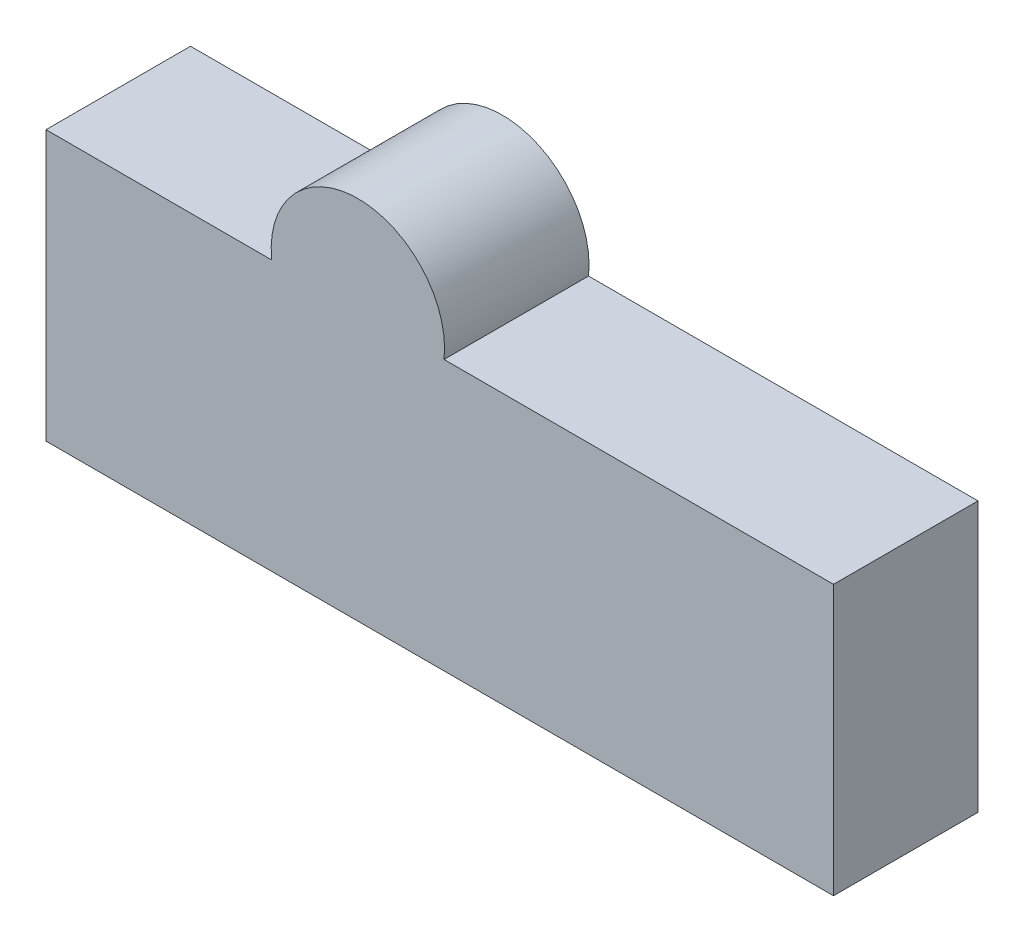
ISO-10303-21;
HEADER;
FILE_DESCRIPTION(('STEP AP214'),'2;1');
FILE_NAME('part.step','',(''),(''),'','','');
FILE_SCHEMA(('AUTOMOTIVE_DESIGN { 1 0 10303 214 1 1 1 1 }'));
ENDSEC;
DATA;
#1=APPLICATION_CONTEXT('core data for automotive mechanical design processes');
#2=APPLICATION_PROTOCOL_DEFINITION('international standard','automotive_design',2000,#1);
#3=PRODUCT_CONTEXT('',#1,'mechanical');
#4=PRODUCT('Part','Part','',(#3));
#5=PRODUCT_RELATED_PRODUCT_CATEGORY('part','',(#4));
#6=PRODUCT_DEFINITION_FORMATION('','',#4);
#7=PRODUCT_DEFINITION_CONTEXT('part definition',#1,'design');
#8=PRODUCT_DEFINITION('design','',#6,#7);
#9=PRODUCT_DEFINITION_SHAPE('','',#8);
#10=(LENGTH_UNIT() NAMED_UNIT(*) SI_UNIT(.MILLI.,.METRE.));
#11=(NAMED_UNIT(*) PLANE_ANGLE_UNIT() SI_UNIT($,.RADIAN.));
#12=(NAMED_UNIT(*) SI_UNIT($,.STERADIAN.) SOLID_ANGLE_UNIT());
#13=UNCERTAINTY_MEASURE_WITH_UNIT(LENGTH_MEASURE(1.E-05),#10,'distance_accuracy_value','');
#14=(GEOMETRIC_REPRESENTATION_CONTEXT(3) GLOBAL_UNCERTAINTY_ASSIGNED_CONTEXT((#13)) GLOBAL_UNIT_ASSIGNED_CONTEXT((#10,
#11,#12)) REPRESENTATION_CONTEXT('',''));
#15=CARTESIAN_POINT('',(0.,0.,0.));
#16=DIRECTION('',(0.,0.,1.));
#17=DIRECTION('',(1.,0.,0.));
#18=AXIS2_PLACEMENT_3D('',#15,#16,#17);
#19=CARTESIAN_POINT('',(14.6625,-5.05377424288444,10.5150221852195));
#20=DIRECTION('',(0.,0.,-1.));
#21=DIRECTION('',(-1.,0.,0.));
#22=AXIS2_PLACEMENT_3D('',#19,#20,#21);
#23=CYLINDRICAL_SURFACE('',#22,0.9);
#24=CARTESIAN_POINT('',(14.6625,-5.05377424288444,1.49999999999999));
#25=DIRECTION('',(0.,0.,1.));
#26=DIRECTION('',(0.,-1.,0.));
#27=AXIS2_PLACEMENT_3D('',#24,#25,#26);
#28=CIRCLE('',#27,0.9);
#29=CARTESIAN_POINT('',(15.5569271909999,-5.15377424288444,1.49999999999999));
#30=VERTEX_POINT('',#29);
#31=CARTESIAN_POINT('',(13.7680728090001,-5.15377424288444,1.49999999999999));
#32=VERTEX_POINT('',#31);
#33=EDGE_CURVE('E114',#30,#32,#28,.T.);
#34=ORIENTED_EDGE('',*,*,#33,.F.);
#35=DIRECTION('',(0.,0.,-1.));
#36=VECTOR('',#35,1.);
#37=CARTESIAN_POINT('',(15.5569271909999,-5.15377424288444,10.5150221852195));
#38=LINE('',#37,#36);
#39=CARTESIAN_POINT('',(15.5569271909999,-5.15377424288444,0.));
#40=VERTEX_POINT('',#39);
#41=EDGE_CURVE('E37',#30,#40,#38,.T.);
#42=ORIENTED_EDGE('',*,*,#41,.T.);
#43=CARTESIAN_POINT('',(14.6625,-5.05377424288444,0.));
#44=DIRECTION('',(0.,0.,1.));
#45=DIRECTION('',(1.,0.,0.));
#46=AXIS2_PLACEMENT_3D('',#43,#44,#45);
#47=CIRCLE('',#46,0.9);
#48=CARTESIAN_POINT('',(13.7680728090001,-5.15377424288444,0.));
#49=VERTEX_POINT('',#48);
#50=EDGE_CURVE('E122',#40,#49,#47,.T.);
#51=ORIENTED_EDGE('',*,*,#50,.T.);
#52=DIRECTION('',(0.,0.,-1.));
#53=VECTOR('',#52,1.);
#54=CARTESIAN_POINT('',(13.7680728090001,-5.15377424288444,10.5150221852195));
#55=LINE('',#54,#53);
#56=EDGE_CURVE('E80',#32,#49,#55,.T.);
#57=ORIENTED_EDGE('',*,*,#56,.F.);
#58=EDGE_LOOP('',(#34,#42,#51,#57));
#59=FACE_BOUND('',#58,.T.);
#60=ADVANCED_FACE('F33',(#59),#23,.T.);
#61=CARTESIAN_POINT('',(11.425,-5.15377424288444,10.5150221852195));
#62=DIRECTION('',(0.,-1.,0.));
#63=DIRECTION('',(1.,0.,0.));
#64=AXIS2_PLACEMENT_3D('',#61,#62,#63);
#65=PLANE('',#64);
#66=DIRECTION('',(-1.,0.,0.));
#67=VECTOR('',#66,1.);
#68=CARTESIAN_POINT('',(11.425,-5.15377424288444,1.49999999999999));
#69=LINE('',#68,#67);
#70=CARTESIAN_POINT('',(11.425,-5.15377424288444,1.49999999999999));
#71=VERTEX_POINT('',#70);
#72=EDGE_CURVE('E87',#32,#71,#69,.T.);
#73=ORIENTED_EDGE('',*,*,#72,.F.);
#74=ORIENTED_EDGE('',*,*,#56,.T.);
#75=DIRECTION('',(-1.,0.,0.));
#76=VECTOR('',#75,1.);
#77=CARTESIAN_POINT('',(11.425,-5.15377424288444,0.));
#78=LINE('',#77,#76);
#79=CARTESIAN_POINT('',(11.425,-5.15377424288444,0.));
#80=VERTEX_POINT('',#79);
#81=EDGE_CURVE('E121',#49,#80,#78,.T.);
#82=ORIENTED_EDGE('',*,*,#81,.T.);
#83=DIRECTION('',(0.,0.,-1.));
#84=VECTOR('',#83,1.);
#85=CARTESIAN_POINT('',(11.425,-5.15377424288444,10.5150221852195));
#86=LINE('',#85,#84);
#87=EDGE_CURVE('E123',#71,#80,#86,.T.);
#88=ORIENTED_EDGE('',*,*,#87,.F.);
#89=EDGE_LOOP('',(#73,#74,#82,#88));
#90=FACE_BOUND('',#89,.T.);
#91=ADVANCED_FACE('F141',(#90),#65,.F.);
#92=CARTESIAN_POINT('',(11.425,-7.95377424288444,10.5150221852195));
#93=DIRECTION('',(1.,0.,0.));
#94=DIRECTION('',(0.,0.,-1.));
#95=AXIS2_PLACEMENT_3D('',#92,#93,#94);
#96=PLANE('',#95);
#97=DIRECTION('',(0.,-1.,0.));
#98=VECTOR('',#97,1.);
#99=CARTESIAN_POINT('',(11.425,-7.95377424288444,1.49999999999999));
#100=LINE('',#99,#98);
#101=CARTESIAN_POINT('',(11.425,-7.95377424288444,1.49999999999999));
#102=VERTEX_POINT('',#101);
#103=EDGE_CURVE('E108',#71,#102,#100,.T.);
#104=ORIENTED_EDGE('',*,*,#103,.F.);
#105=ORIENTED_EDGE('',*,*,#87,.T.);
#106=DIRECTION('',(0.,-1.,0.));
#107=VECTOR('',#106,1.);
#108=CARTESIAN_POINT('',(11.425,-7.95377424288444,0.));
#109=LINE('',#108,#107);
#110=CARTESIAN_POINT('',(11.425,-7.95377424288444,0.));
#111=VERTEX_POINT('',#110);
#112=EDGE_CURVE('E125',#80,#111,#109,.T.);
#113=ORIENTED_EDGE('',*,*,#112,.T.);
#114=DIRECTION('',(0.,0.,-1.));
#115=VECTOR('',#114,1.);
#116=CARTESIAN_POINT('',(11.425,-7.95377424288444,10.5150221852195));
#117=LINE('',#116,#115);
#118=EDGE_CURVE('E126',#102,#111,#117,.T.);
#119=ORIENTED_EDGE('',*,*,#118,.F.);
#120=EDGE_LOOP('',(#104,#105,#113,#119));
#121=FACE_BOUND('',#120,.T.);
#122=ADVANCED_FACE('F143',(#121),#96,.F.);
#123=CARTESIAN_POINT('',(19.6,-7.95377424288444,10.5150221852195));
#124=DIRECTION('',(0.,1.,0.));
#125=DIRECTION('',(0.,0.,1.));
#126=AXIS2_PLACEMENT_3D('',#123,#124,#125);
#127=PLANE('',#126);
#128=DIRECTION('',(1.,0.,0.));
#129=VECTOR('',#128,1.);
#130=CARTESIAN_POINT('',(19.6,-7.95377424288444,1.49999999999999));
#131=LINE('',#130,#129);
#132=CARTESIAN_POINT('',(19.6,-7.95377424288444,1.49999999999999));
#133=VERTEX_POINT('',#132);
#134=EDGE_CURVE('E42',#102,#133,#131,.T.);
#135=ORIENTED_EDGE('',*,*,#134,.F.);
#136=ORIENTED_EDGE('',*,*,#118,.T.);
#137=DIRECTION('',(1.,0.,0.));
#138=VECTOR('',#137,1.);
#139=CARTESIAN_POINT('',(19.6,-7.95377424288444,0.));
#140=LINE('',#139,#138);
#141=CARTESIAN_POINT('',(19.6,-7.95377424288444,0.));
#142=VERTEX_POINT('',#141);
#143=EDGE_CURVE('E103',#111,#142,#140,.T.);
#144=ORIENTED_EDGE('',*,*,#143,.T.);
#145=DIRECTION('',(0.,0.,-1.));
#146=VECTOR('',#145,1.);
#147=CARTESIAN_POINT('',(19.6,-7.95377424288444,10.5150221852195));
#148=LINE('',#147,#146);
#149=EDGE_CURVE('E94',#133,#142,#148,.T.);
#150=ORIENTED_EDGE('',*,*,#149,.F.);
#151=EDGE_LOOP('',(#135,#136,#144,#150));
#152=FACE_BOUND('',#151,.T.);
#153=ADVANCED_FACE('F100',(#152),#127,.F.);
#154=CARTESIAN_POINT('',(19.6,-5.15377424288444,10.5150221852195));
#155=DIRECTION('',(-1.,0.,0.));
#156=DIRECTION('',(0.,0.,1.));
#157=AXIS2_PLACEMENT_3D('',#154,#155,#156);
#158=PLANE('',#157);
#159=DIRECTION('',(0.,1.,0.));
#160=VECTOR('',#159,1.);
#161=CARTESIAN_POINT('',(19.6,-5.15377424288444,1.49999999999999));
#162=LINE('',#161,#160);
#163=CARTESIAN_POINT('',(19.6,-5.15377424288444,1.49999999999999));
#164=VERTEX_POINT('',#163);
#165=EDGE_CURVE('E11',#133,#164,#162,.T.);
#166=ORIENTED_EDGE('',*,*,#165,.F.);
#167=ORIENTED_EDGE('',*,*,#149,.T.);
#168=DIRECTION('',(0.,1.,0.));
#169=VECTOR('',#168,1.);
#170=CARTESIAN_POINT('',(19.6,-5.15377424288444,0.));
#171=LINE('',#170,#169);
#172=CARTESIAN_POINT('',(19.6,-5.15377424288444,0.));
#173=VERTEX_POINT('',#172);
#174=EDGE_CURVE('E105',#142,#173,#171,.T.);
#175=ORIENTED_EDGE('',*,*,#174,.T.);
#176=DIRECTION('',(0.,0.,-1.));
#177=VECTOR('',#176,1.);
#178=CARTESIAN_POINT('',(19.6,-5.15377424288444,10.5150221852195));
#179=LINE('',#178,#177);
#180=EDGE_CURVE('E55',#164,#173,#179,.T.);
#181=ORIENTED_EDGE('',*,*,#180,.F.);
#182=EDGE_LOOP('',(#166,#167,#175,#181));
#183=FACE_BOUND('',#182,.T.);
#184=ADVANCED_FACE('F93',(#183),#158,.F.);
#185=CARTESIAN_POINT('',(15.5569271909999,-5.15377424288444,10.5150221852195));
#186=DIRECTION('',(0.,-1.,0.));
#187=DIRECTION('',(0.,0.,-1.));
#188=AXIS2_PLACEMENT_3D('',#185,#186,#187);
#189=PLANE('',#188);
#190=DIRECTION('',(-1.,0.,0.));
#191=VECTOR('',#190,1.);
#192=CARTESIAN_POINT('',(15.5569271909999,-5.15377424288444,1.49999999999999));
#193=LINE('',#192,#191);
#194=EDGE_CURVE('E117',#164,#30,#193,.T.);
#195=ORIENTED_EDGE('',*,*,#194,.F.);
#196=ORIENTED_EDGE('',*,*,#180,.T.);
#197=DIRECTION('',(-1.,0.,0.));
#198=VECTOR('',#197,1.);
#199=CARTESIAN_POINT('',(15.5569271909999,-5.15377424288444,0.));
#200=LINE('',#199,#198);
#201=EDGE_CURVE('E119',#173,#40,#200,.T.);
#202=ORIENTED_EDGE('',*,*,#201,.T.);
#203=ORIENTED_EDGE('',*,*,#41,.F.);
#204=EDGE_LOOP('',(#195,#196,#202,#203));
#205=FACE_BOUND('',#204,.T.);
#206=ADVANCED_FACE('F137',(#205),#189,.F.);
#207=CARTESIAN_POINT('',(14.6625,-5.05377424288444,0.));
#208=DIRECTION('',(0.,0.,1.));
#209=DIRECTION('',(1.,0.,0.));
#210=AXIS2_PLACEMENT_3D('',#207,#208,#209);
#211=PLANE('',#210);
#212=ORIENTED_EDGE('',*,*,#50,.F.);
#213=ORIENTED_EDGE('',*,*,#201,.F.);
#214=ORIENTED_EDGE('',*,*,#174,.F.);
#215=ORIENTED_EDGE('',*,*,#143,.F.);
#216=ORIENTED_EDGE('',*,*,#112,.F.);
#217=ORIENTED_EDGE('',*,*,#81,.F.);
#218=EDGE_LOOP('',(#212,#213,#214,#215,#216,#217));
#219=FACE_BOUND('',#218,.T.);
#220=ADVANCED_FACE('F139',(#219),#211,.F.);
#221=CARTESIAN_POINT('',(0.,-2.89024138422009,1.49999999999999));
#222=DIRECTION('',(0.,0.,1.));
#223=DIRECTION('',(1.,0.,0.));
#224=AXIS2_PLACEMENT_3D('',#221,#222,#223);
#225=PLANE('',#224);
#226=ORIENTED_EDGE('',*,*,#194,.T.);
#227=ORIENTED_EDGE('',*,*,#33,.T.);
#228=ORIENTED_EDGE('',*,*,#72,.T.);
#229=ORIENTED_EDGE('',*,*,#103,.T.);
#230=ORIENTED_EDGE('',*,*,#134,.T.);
#231=ORIENTED_EDGE('',*,*,#165,.T.);
#232=EDGE_LOOP('',(#226,#227,#228,#229,#230,#231));
#233=FACE_BOUND('',#232,.T.);
#234=ADVANCED_FACE('F35',(#233),#225,.T.);
#235=CLOSED_SHELL('',(#60,#91,#122,#153,#184,#206,#220,#234));
#236=MANIFOLD_SOLID_BREP('B2',#235);
#237=ADVANCED_BREP_SHAPE_REPRESENTATION('',(#18,#236),#14);
#238=SHAPE_DEFINITION_REPRESENTATION(#9,#237);
ENDSEC;
END-ISO-10303-21;
